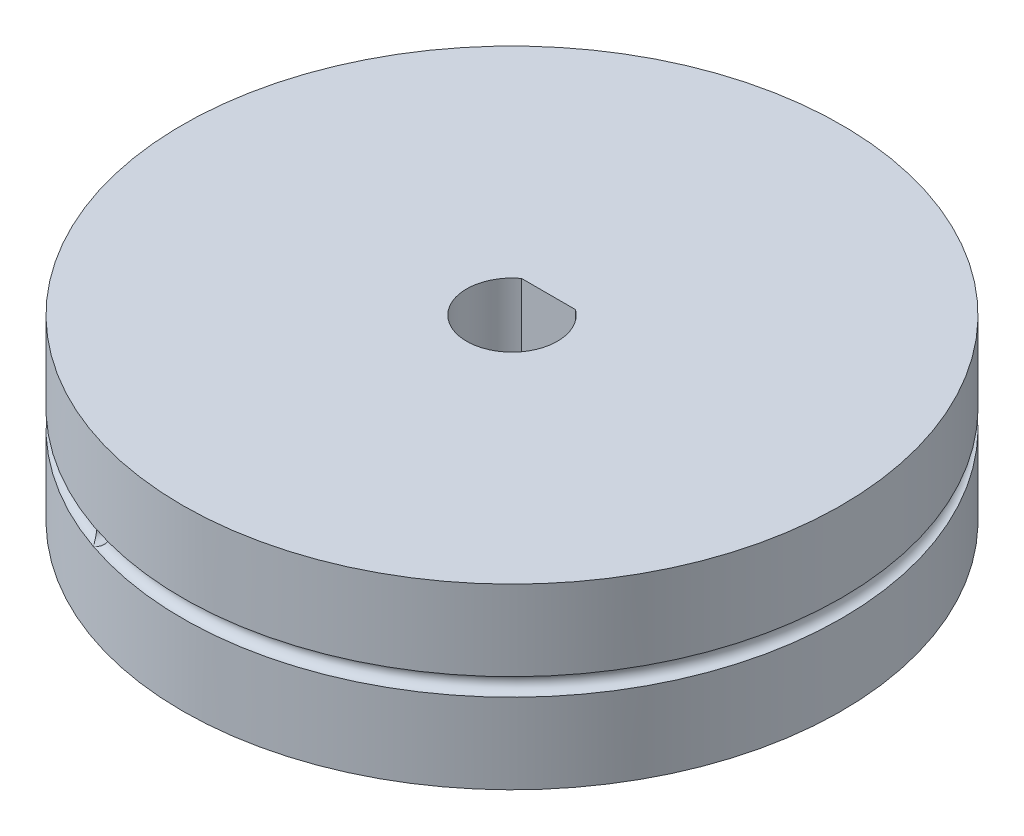
ISO-10303-21;
HEADER;
FILE_DESCRIPTION(('STEP AP214'),'2;1');
FILE_NAME('part.step','',(''),(''),'','','');
FILE_SCHEMA(('AUTOMOTIVE_DESIGN { 1 0 10303 214 1 1 1 1 }'));
ENDSEC;
DATA;
#1=APPLICATION_CONTEXT('core data for automotive mechanical design processes');
#2=APPLICATION_PROTOCOL_DEFINITION('international standard','automotive_design',2000,#1);
#3=PRODUCT_CONTEXT('',#1,'mechanical');
#4=PRODUCT('Part','Part','',(#3));
#5=PRODUCT_RELATED_PRODUCT_CATEGORY('part','',(#4));
#6=PRODUCT_DEFINITION_FORMATION('','',#4);
#7=PRODUCT_DEFINITION_CONTEXT('part definition',#1,'design');
#8=PRODUCT_DEFINITION('design','',#6,#7);
#9=PRODUCT_DEFINITION_SHAPE('','',#8);
#10=(LENGTH_UNIT() NAMED_UNIT(*) SI_UNIT(.MILLI.,.METRE.));
#11=(NAMED_UNIT(*) PLANE_ANGLE_UNIT() SI_UNIT($,.RADIAN.));
#12=(NAMED_UNIT(*) SI_UNIT($,.STERADIAN.) SOLID_ANGLE_UNIT());
#13=UNCERTAINTY_MEASURE_WITH_UNIT(LENGTH_MEASURE(1.E-05),#10,'distance_accuracy_value','');
#14=(GEOMETRIC_REPRESENTATION_CONTEXT(3) GLOBAL_UNCERTAINTY_ASSIGNED_CONTEXT((#13)) GLOBAL_UNIT_ASSIGNED_CONTEXT((#10,
#11,#12)) REPRESENTATION_CONTEXT('',''));
#15=CARTESIAN_POINT('',(0.,0.,0.));
#16=DIRECTION('',(0.,0.,1.));
#17=DIRECTION('',(1.,0.,0.));
#18=AXIS2_PLACEMENT_3D('',#15,#16,#17);
#19=CARTESIAN_POINT('',(0.,5.,0.));
#20=DIRECTION('',(0.,1.,0.));
#21=DIRECTION('',(0.,0.,1.));
#22=AXIS2_PLACEMENT_3D('',#19,#20,#21);
#23=TOROIDAL_SURFACE('',#22,18.5,0.499999999999999);
#24=CARTESIAN_POINT('',(-6.,4.5,17.5));
#25=CARTESIAN_POINT('',(-6.00089082453227,4.50000002366187,17.4987528477029));
#26=CARTESIAN_POINT('',(-6.00178163425127,4.50000240356781,17.4975055807074));
#27=CARTESIAN_POINT('',(-6.0501565773212,4.50025972197273,17.4297660691981));
#28=CARTESIAN_POINT('',(-6.09758176117397,4.50721376263087,17.3629720413323));
#29=CARTESIAN_POINT('',(-6.16730734949084,4.52819986412539,17.264212661646));
#30=CARTESIAN_POINT('',(-6.19032623206661,4.53696220439458,17.2315137266585));
#31=CARTESIAN_POINT('',(-6.23567722129492,4.55831625991109,17.1669115512512));
#32=CARTESIAN_POINT('',(-6.25801012958801,4.57090330227527,17.1350073909837));
#33=CARTESIAN_POINT('',(-6.29794876104842,4.59787491991483,17.0777980487317));
#34=CARTESIAN_POINT('',(-6.315713995237,4.61159293541338,17.0522911276434));
#35=CARTESIAN_POINT('',(-6.35025524078634,4.64242785628903,17.0025912660083));
#36=CARTESIAN_POINT('',(-6.36702990057882,4.6595492724462,16.9784001241435));
#37=CARTESIAN_POINT('',(-6.3992814234726,4.69798114794401,16.9317973145947));
#38=CARTESIAN_POINT('',(-6.41473604393395,4.71934853678563,16.9094163932503));
#39=CARTESIAN_POINT('',(-6.44309439299227,4.76671856191877,16.8682776851541));
#40=CARTESIAN_POINT('',(-6.45601314312225,4.79269205316861,16.8494985787977));
#41=CARTESIAN_POINT('',(-6.4712896959111,4.83255759990131,16.8272650069137));
#42=CARTESIAN_POINT('',(-6.47535555088504,4.84443443447294,16.8213437919529));
#43=CARTESIAN_POINT('',(-6.48268938914577,4.8689475392764,16.8106587633007));
#44=CARTESIAN_POINT('',(-6.48595698313059,4.88158417632596,16.8058955143403));
#45=CARTESIAN_POINT('',(-6.49223564589433,4.91069134765433,16.7967401495371));
#46=CARTESIAN_POINT('',(-6.49498706774411,4.92734183257898,16.7927258377733));
#47=CARTESIAN_POINT('',(-6.49878683354962,4.96124257750273,16.787181215093));
#48=CARTESIAN_POINT('',(-6.49983601753373,4.97849253737456,16.7856496789651));
#49=CARTESIAN_POINT('',(-6.50012840396766,5.0130720593386,16.7852229145944));
#50=CARTESIAN_POINT('',(-6.49936852361962,5.03040170701285,16.7863321865109));
#51=CARTESIAN_POINT('',(-6.49611414814097,5.06454170462213,16.7910813257638));
#52=CARTESIAN_POINT('',(-6.49361842854827,5.08135167923163,16.7947229794436));
#53=CARTESIAN_POINT('',(-6.48656235733421,5.11677342647042,16.8050133807671));
#54=CARTESIAN_POINT('',(-6.4817247195097,5.13521072351581,16.8120657996442));
#55=CARTESIAN_POINT('',(-6.47041694934697,5.1704463507268,16.8285364014509));
#56=CARTESIAN_POINT('',(-6.46394422235347,5.18724201654516,16.8379583443735));
#57=CARTESIAN_POINT('',(-6.44639613722278,5.22670211310883,16.8634758540469));
#58=CARTESIAN_POINT('',(-6.43459534562485,5.24836203012125,16.88061496648));
#59=CARTESIAN_POINT('',(-6.40923687781034,5.28824507433734,16.9173796800758));
#60=CARTESIAN_POINT('',(-6.39567522526671,5.30646018666664,16.9370109065534));
#61=CARTESIAN_POINT('',(-6.35788457277012,5.35108594483659,16.9916100355349));
#62=CARTESIAN_POINT('',(-6.33259961001591,5.3748036340589,17.0280361805101));
#63=CARTESIAN_POINT('',(-6.28020123026314,5.4154337459751,17.1032620329268));
#64=CARTESIAN_POINT('',(-6.25308325800474,5.4323284280945,17.1420676296146));
#65=CARTESIAN_POINT('',(-6.18949086009377,5.46445182288929,17.2327468661475));
#66=CARTESIAN_POINT('',(-6.15264081677689,5.47767615075106,17.2850621562151));
#67=CARTESIAN_POINT('',(-6.07811005647727,5.495336726099,17.3903818131184));
#68=CARTESIAN_POINT('',(-6.04043127444163,5.49979161829345,17.4433844763236));
#69=CARTESIAN_POINT('',(-6.00178165840606,5.49999760552885,17.4975055457104));
#70=CARTESIAN_POINT('',(-6.0008908490347,5.49999998566952,17.4987528121976));
#71=CARTESIAN_POINT('',(-6.,5.5,17.5));
#72=B_SPLINE_CURVE_WITH_KNOTS('',3,(#24,#25,#26,#27,#28,#29,#30,#31,#32,#33,#34,#35,#36,#37,#38,
#39,#40,#41,#42,#43,#44,#45,#46,#47,#48,#49,#50,#51,#52,#53,#54,#55,#56,#57,#58,#59,#60,#61,#62,
#63,#64,#65,#66,#67,#68,#69,#70,#71),.UNSPECIFIED.,.F.,.F.,(4,2,2,2,2,2,2,2,2,2,2,2,2,2,2,2,2,2,
2,2,2,2,2,4),(0.,0.00459814182074894,0.249705437929898,0.3723953658226,0.49493599421972,
0.596700953711476,0.698601700133934,0.801974162682908,0.904714470788939,0.946278430140854,
0.987862619434869,1.03964972093591,1.09141125851172,1.14326106522233,1.19514748396182,
1.25578757384,1.31652450217346,1.40612745068738,1.49593637644598,1.64595714716207,
1.79636551527864,1.9916930297503,2.18660480767776,2.1912029494985),.UNSPECIFIED.);
#73=CARTESIAN_POINT('',(-6.,4.5,17.5));
#74=VERTEX_POINT('',#73);
#75=CARTESIAN_POINT('',(-6.,5.5,17.5));
#76=VERTEX_POINT('',#75);
#77=EDGE_CURVE('E62',#74,#76,#72,.T.);
#78=ORIENTED_EDGE('',*,*,#77,.T.);
#79=CARTESIAN_POINT('',(0.,5.5,0.));
#80=DIRECTION('',(0.,-1.,0.));
#81=DIRECTION('',(0.,0.,-1.));
#82=AXIS2_PLACEMENT_3D('',#79,#80,#81);
#83=CIRCLE('',#82,18.5);
#84=CARTESIAN_POINT('',(-6.,5.5,-17.5));
#85=VERTEX_POINT('',#84);
#86=EDGE_CURVE('E43',#85,#76,#83,.F.);
#87=ORIENTED_EDGE('',*,*,#86,.F.);
#88=CARTESIAN_POINT('',(-6.,5.5,-17.5));
#89=CARTESIAN_POINT('',(-6.00089082455213,5.49999997633397,-17.4987528476737));
#90=CARTESIAN_POINT('',(-6.0017816342706,5.49999759642809,-17.4975055806786));
#91=CARTESIAN_POINT('',(-6.05015544973691,5.49974028423594,-17.4297676481871));
#92=CARTESIAN_POINT('',(-6.09757945383221,5.49278657912727,-17.3629752933665));
#93=CARTESIAN_POINT('',(-6.16730451052101,5.47180116624821,-17.264216690901));
#94=CARTESIAN_POINT('',(-6.1903238930566,5.46303879002751,-17.2315170513602));
#95=CARTESIAN_POINT('',(-6.23567584726904,5.4416844940225,-17.1669135157041));
#96=CARTESIAN_POINT('',(-6.25800921400838,5.42909720692975,-17.1350087071991));
#97=CARTESIAN_POINT('',(-6.2982776968772,5.40190303324392,-17.0773268668012));
#98=CARTESIAN_POINT('',(-6.31635923760526,5.38790864135831,-17.0513646722674));
#99=CARTESIAN_POINT('',(-6.35148895320386,5.35638887731775,-17.0008140726695));
#100=CARTESIAN_POINT('',(-6.36853575086355,5.33885892793843,-16.97622750178));
#101=CARTESIAN_POINT('',(-6.40126947340671,5.29942012872321,-16.92892089962));
#102=CARTESIAN_POINT('',(-6.4169316962742,5.27744857846575,-16.9062350503115));
#103=CARTESIAN_POINT('',(-6.44554895738091,5.22864153496645,-16.8647124636616));
#104=CARTESIAN_POINT('',(-6.45851861047782,5.20183385944444,-16.8458549596967));
#105=CARTESIAN_POINT('',(-6.47480999309058,5.15751400298365,-16.8221394975521));
#106=CARTESIAN_POINT('',(-6.47975094364808,5.14185150369109,-16.8149410316029));
#107=CARTESIAN_POINT('',(-6.48818512514438,5.10934516843046,-16.8026475978512));
#108=CARTESIAN_POINT('',(-6.49167964881386,5.092502403128,-16.7975507517608));
#109=CARTESIAN_POINT('',(-6.49695604726528,5.05782880355579,-16.789853163933));
#110=CARTESIAN_POINT('',(-6.49872337882397,5.03999089364568,-16.7872736185133));
#111=CARTESIAN_POINT('',(-6.50030654084355,5.00404568469862,-16.7849629452451));
#112=CARTESIAN_POINT('',(-6.50012330428603,4.98593851858876,-16.7852304556135));
#113=CARTESIAN_POINT('',(-6.49794914866464,4.95197583049766,-16.7884035412623));
#114=CARTESIAN_POINT('',(-6.49614678992303,4.93608082958431,-16.7910339375068));
#115=CARTESIAN_POINT('',(-6.49114465911752,4.90499908012884,-16.7983310162129));
#116=CARTESIAN_POINT('',(-6.48794415241748,4.88981270857478,-16.8029987691722));
#117=CARTESIAN_POINT('',(-6.47896159773439,4.85499244454548,-16.816091644344));
#118=CARTESIAN_POINT('',(-6.47266306468696,4.83577560344016,-16.8252672148793));
#119=CARTESIAN_POINT('',(-6.45840136841942,4.79936959085612,-16.8460215272866));
#120=CARTESIAN_POINT('',(-6.45043458315658,4.7821849607977,-16.8576054977839));
#121=CARTESIAN_POINT('',(-6.42866804575398,4.74107922808024,-16.8892163451968));
#122=CARTESIAN_POINT('',(-6.414038518223,4.71851827324338,-16.9104290385831));
#123=CARTESIAN_POINT('',(-6.38298565080738,4.67753431551371,-16.9553594723429));
#124=CARTESIAN_POINT('',(-6.36655795210863,4.6591217138387,-16.9790832949573));
#125=CARTESIAN_POINT('',(-6.32086130362482,4.61443068895067,-17.0449256448849));
#126=CARTESIAN_POINT('',(-6.29051243576212,4.59141828608175,-17.0885009814506));
#127=CARTESIAN_POINT('',(-6.22806570308272,4.55355147940975,-17.1777994089158));
#128=CARTESIAN_POINT('',(-6.19596534315206,4.53870906640157,-17.2235255502814));
#129=CARTESIAN_POINT('',(-6.13702927256662,4.51833850557306,-17.3071362565104));
#130=CARTESIAN_POINT('',(-6.11036151140229,4.51157153000903,-17.3448470646652));
#131=CARTESIAN_POINT('',(-6.05670132912268,4.50248221869649,-17.4204782126569));
#132=CARTESIAN_POINT('',(-6.02970962439644,4.50015142871467,-17.4583980155428));
#133=CARTESIAN_POINT('',(-6.0017816631718,4.50000238826375,-17.4975055387325));
#134=CARTESIAN_POINT('',(-6.00089085374311,4.50000000790593,-17.4987528052927));
#135=CARTESIAN_POINT('',(-6.,4.5,-17.5));
#136=B_SPLINE_CURVE_WITH_KNOTS('',3,(#88,#89,#90,#91,#92,#93,#94,#95,#96,#97,#98,#99,#100,#101,
#102,#103,#104,#105,#106,#107,#108,#109,#110,#111,#112,#113,#114,#115,#116,#117,#118,#119,#120,
#121,#122,#123,#124,#125,#126,#127,#128,#129,#130,#131,#132,#133,#134,#135),.UNSPECIFIED.,.F.,
.F.,(4,2,2,2,2,2,2,2,2,2,2,2,2,2,2,2,2,2,2,2,2,2,2,4),(0.,0.00459814182073694,0.249699622952677,
0.372391823392671,0.494936008681134,0.598547015829722,0.702293031586386,0.807621147054346,
0.912361680009282,0.965977683648832,1.01954566446822,1.07356090641279,1.12755031334023,
1.17596637597353,1.22440790876579,1.29065531810631,1.35704808085879,1.45921871658818,
1.56164274362171,1.73431244169161,1.90723488961331,2.04706884516284,2.18663604513594,
2.1912341869567),.UNSPECIFIED.);
#137=CARTESIAN_POINT('',(-6.,4.5,-17.5));
#138=VERTEX_POINT('',#137);
#139=EDGE_CURVE('E79',#138,#85,#136,.F.);
#140=ORIENTED_EDGE('',*,*,#139,.F.);
#141=CARTESIAN_POINT('',(0.,4.5,0.));
#142=DIRECTION('',(0.,1.,0.));
#143=DIRECTION('',(0.,0.,1.));
#144=AXIS2_PLACEMENT_3D('',#141,#142,#143);
#145=CIRCLE('',#144,18.5);
#146=EDGE_CURVE('E100',#74,#138,#145,.F.);
#147=ORIENTED_EDGE('',*,*,#146,.F.);
#148=EDGE_LOOP('',(#78,#87,#140,#147));
#149=FACE_BOUND('',#148,.T.);
#150=ADVANCED_FACE('F39',(#149),#23,.F.);
#151=CARTESIAN_POINT('',(-6.,5.5,17.5));
#152=CARTESIAN_POINT('',(-5.99875286013006,5.50000000246173,17.4991091866197));
#153=CARTESIAN_POINT('',(-5.99750566419402,5.49999533625984,17.4982182643048));
#154=CARTESIAN_POINT('',(-5.96176696349385,5.4997278248078,17.4726866998688));
#155=CARTESIAN_POINT('',(-5.92725322516525,5.49589850628534,17.4479776559006));
#156=CARTESIAN_POINT('',(-5.85923334397666,5.48104162991155,17.399179020931));
#157=CARTESIAN_POINT('',(-5.8257300465583,5.46999542860868,17.3750912027397));
#158=CARTESIAN_POINT('',(-5.76662427936852,5.4431661074981,17.3325121796306));
#159=CARTESIAN_POINT('',(-5.74066599565571,5.42855201771749,17.3137798438771));
#160=CARTESIAN_POINT('',(-5.69107935446952,5.39430074014829,17.2779426849561));
#161=CARTESIAN_POINT('',(-5.66744646376597,5.37467360499844,17.2608346975872));
#162=CARTESIAN_POINT('',(-5.62754193099748,5.33454561272405,17.2319098731094));
#163=CARTESIAN_POINT('',(-5.61071750726956,5.31487938694414,17.2196998545424));
#164=CARTESIAN_POINT('',(-5.57989272295977,5.27239244183149,17.1973091891235));
#165=CARTESIAN_POINT('',(-5.56589199985526,5.24957212807319,17.1871282817649));
#166=CARTESIAN_POINT('',(-5.54134355786307,5.20095167064473,17.1692652702425));
#167=CARTESIAN_POINT('',(-5.53082596486103,5.1751280131865,17.1616049704929));
#168=CARTESIAN_POINT('',(-5.51415230183724,5.12140781203751,17.1494561227));
#169=CARTESIAN_POINT('',(-5.50799102645169,5.09351378643957,17.1449637892707));
#170=CARTESIAN_POINT('',(-5.50107530121365,5.04090149008203,17.1399208776117));
#171=CARTESIAN_POINT('',(-5.49966294641665,5.01631393082996,17.1388906767636));
#172=CARTESIAN_POINT('',(-5.50047237838281,4.96723517445916,17.1394810208957));
#173=CARTESIAN_POINT('',(-5.50269277807456,4.9427439441386,17.1411005541448));
#174=CARTESIAN_POINT('',(-5.51033577019213,4.89635187295668,17.1466731780932));
#175=CARTESIAN_POINT('',(-5.51552174869889,4.87439009388484,17.1504538322199));
#176=CARTESIAN_POINT('',(-5.5286268234582,4.83175952247426,17.1600027168865));
#177=CARTESIAN_POINT('',(-5.53654630852725,4.81109091457172,17.1657712301812));
#178=CARTESIAN_POINT('',(-5.55534660874129,4.77016872601337,17.1794561822445));
#179=CARTESIAN_POINT('',(-5.56638413107472,4.75002577025698,17.1874861855941));
#180=CARTESIAN_POINT('',(-5.59069984687954,4.71192908256376,17.2051612684435));
#181=CARTESIAN_POINT('',(-5.60397902139168,4.69397631509669,17.2148070550634));
#182=CARTESIAN_POINT('',(-5.63454336934135,4.65782364921528,17.2369871207876));
#183=CARTESIAN_POINT('',(-5.65213052163766,4.64001244312768,17.2497374526048));
#184=CARTESIAN_POINT('',(-5.68915635928956,4.60759335945884,17.2765473757278));
#185=CARTESIAN_POINT('',(-5.70859640547321,4.59298786266789,17.2906079291327));
#186=CARTESIAN_POINT('',(-5.75273180529088,4.56448396838277,17.3224881183305));
#187=CARTESIAN_POINT('',(-5.77771873035251,4.55126205989683,17.3405105687051));
#188=CARTESIAN_POINT('',(-5.82896166483527,4.52933612980629,17.3774101605116));
#189=CARTESIAN_POINT('',(-5.85521777390313,4.52063246357168,17.3962873690453));
#190=CARTESIAN_POINT('',(-5.91949099033167,4.50501187665394,17.4424195093236));
#191=CARTESIAN_POINT('',(-5.95790468762886,4.50030133516918,17.4699274947938));
#192=CARTESIAN_POINT('',(-5.99750569931301,4.5000046553455,17.4982182898113));
#193=CARTESIAN_POINT('',(-5.99875289608272,4.4999999889517,17.4991092127347));
#194=CARTESIAN_POINT('',(-6.,4.5,17.5));
#195=B_SPLINE_CURVE_WITH_KNOTS('',3,(#151,#152,#153,#154,#155,#156,#157,#158,#159,#160,#161,
#162,#163,#164,#165,#166,#167,#168,#169,#170,#171,#172,#173,#174,#175,#176,#177,#178,#179,#180,
#181,#182,#183,#184,#185,#186,#187,#188,#189,#190,#191,#192,#193,#194),.UNSPECIFIED.,.F.,.F.,(4,
2,2,2,2,2,2,2,2,2,2,2,2,2,2,2,2,2,2,2,2,4),(0.,0.00459815758273977,0.131758240530638,
0.259248123335437,0.364400914960967,0.469344477355052,0.554857310297851,0.640359157621418,
0.726582297723804,0.812702234881679,0.886252428653456,0.959774545778578,1.02811704758025,
1.09646927449128,1.16918272801467,1.24192808688053,1.32588975513571,1.40991356994139,
1.51010064933817,1.61029560748216,1.75169080178366,1.7562889593664),.UNSPECIFIED.);
#196=EDGE_CURVE('E95',#76,#74,#195,.T.);
#197=ORIENTED_EDGE('',*,*,#196,.T.);
#198=EDGE_CURVE('E93',#138,#74,#145,.F.);
#199=ORIENTED_EDGE('',*,*,#198,.F.);
#200=CARTESIAN_POINT('',(-6.,5.5,-17.5));
#201=CARTESIAN_POINT('',(-5.99875286013006,5.50000000246173,-17.4991091866197));
#202=CARTESIAN_POINT('',(-5.99750566419402,5.49999533625984,-17.4982182643048));
#203=CARTESIAN_POINT('',(-5.96176696349385,5.4997278248078,-17.4726866998688));
#204=CARTESIAN_POINT('',(-5.92725322516525,5.49589850628534,-17.4479776559006));
#205=CARTESIAN_POINT('',(-5.85923334397666,5.48104162991155,-17.399179020931));
#206=CARTESIAN_POINT('',(-5.8257300465583,5.46999542860867,-17.3750912027397));
#207=CARTESIAN_POINT('',(-5.76662427936852,5.4431661074981,-17.3325121796306));
#208=CARTESIAN_POINT('',(-5.74066599565571,5.42855201771749,-17.3137798438771));
#209=CARTESIAN_POINT('',(-5.69107935446952,5.39430074014829,-17.2779426849561));
#210=CARTESIAN_POINT('',(-5.66744646376597,5.37467360499844,-17.2608346975872));
#211=CARTESIAN_POINT('',(-5.62754193099748,5.33454561272405,-17.2319098731095));
#212=CARTESIAN_POINT('',(-5.61071750726956,5.31487938694414,-17.2196998545424));
#213=CARTESIAN_POINT('',(-5.57989272295977,5.27239244183149,-17.1973091891235));
#214=CARTESIAN_POINT('',(-5.56589199985526,5.24957212807319,-17.1871282817649));
#215=CARTESIAN_POINT('',(-5.54134355786307,5.20095167064473,-17.1692652702425));
#216=CARTESIAN_POINT('',(-5.53082596486103,5.1751280131865,-17.1616049704929));
#217=CARTESIAN_POINT('',(-5.51415230183724,5.12140781203751,-17.1494561227));
#218=CARTESIAN_POINT('',(-5.50799102645169,5.09351378643957,-17.1449637892707));
#219=CARTESIAN_POINT('',(-5.50107530121365,5.04090149008203,-17.1399208776117));
#220=CARTESIAN_POINT('',(-5.49966294641665,5.01631393082996,-17.1388906767636));
#221=CARTESIAN_POINT('',(-5.50047237838281,4.96723517445916,-17.1394810208957));
#222=CARTESIAN_POINT('',(-5.50269277807456,4.9427439441386,-17.1411005541448));
#223=CARTESIAN_POINT('',(-5.51033577019213,4.89635187295668,-17.1466731780932));
#224=CARTESIAN_POINT('',(-5.51552174869889,4.87439009388484,-17.1504538322199));
#225=CARTESIAN_POINT('',(-5.5286268234582,4.83175952247426,-17.1600027168865));
#226=CARTESIAN_POINT('',(-5.53654630852725,4.81109091457172,-17.1657712301812));
#227=CARTESIAN_POINT('',(-5.55534660874129,4.77016872601337,-17.1794561822445));
#228=CARTESIAN_POINT('',(-5.56638413107472,4.75002577025698,-17.1874861855941));
#229=CARTESIAN_POINT('',(-5.59069984687954,4.71192908256376,-17.2051612684435));
#230=CARTESIAN_POINT('',(-5.60397902139168,4.69397631509669,-17.2148070550634));
#231=CARTESIAN_POINT('',(-5.63454336934135,4.65782364921528,-17.2369871207876));
#232=CARTESIAN_POINT('',(-5.65213052163766,4.64001244312768,-17.2497374526048));
#233=CARTESIAN_POINT('',(-5.68915635928956,4.60759335945884,-17.2765473757278));
#234=CARTESIAN_POINT('',(-5.7085964054732,4.59298786266789,-17.2906079291327));
#235=CARTESIAN_POINT('',(-5.75273180529088,4.56448396838277,-17.3224881183305));
#236=CARTESIAN_POINT('',(-5.77771873035251,4.55126205989683,-17.3405105687051));
#237=CARTESIAN_POINT('',(-5.82896166483528,4.52933612980629,-17.3774101605116));
#238=CARTESIAN_POINT('',(-5.85521777390313,4.52063246357168,-17.3962873690453));
#239=CARTESIAN_POINT('',(-5.91949099033167,4.50501187665394,-17.4424195093237));
#240=CARTESIAN_POINT('',(-5.95790468762885,4.50030133516917,-17.4699274947938));
#241=CARTESIAN_POINT('',(-5.99750569931301,4.5000046553455,-17.4982182898113));
#242=CARTESIAN_POINT('',(-5.99875289608272,4.4999999889517,-17.4991092127347));
#243=CARTESIAN_POINT('',(-6.,4.5,-17.5));
#244=B_SPLINE_CURVE_WITH_KNOTS('',3,(#200,#201,#202,#203,#204,#205,#206,#207,#208,#209,#210,
#211,#212,#213,#214,#215,#216,#217,#218,#219,#220,#221,#222,#223,#224,#225,#226,#227,#228,#229,
#230,#231,#232,#233,#234,#235,#236,#237,#238,#239,#240,#241,#242,#243),.UNSPECIFIED.,.F.,.F.,(4,
2,2,2,2,2,2,2,2,2,2,2,2,2,2,2,2,2,2,2,2,4),(0.,0.00459815758274048,0.13175824053064,
0.259248123335438,0.364400914960966,0.469344477355048,0.554857310297848,0.640359157621417,
0.726582297723802,0.812702234881678,0.886252428653455,0.959774545778578,1.02811704758025,
1.09646927449128,1.16918272801467,1.24192808688053,1.32588975513571,1.40991356994139,
1.51010064933817,1.61029560748215,1.75169080178366,1.7562889593664),.UNSPECIFIED.);
#245=EDGE_CURVE('E55',#85,#138,#244,.T.);
#246=ORIENTED_EDGE('',*,*,#245,.F.);
#247=EDGE_CURVE('E90',#76,#85,#83,.F.);
#248=ORIENTED_EDGE('',*,*,#247,.F.);
#249=EDGE_LOOP('',(#197,#199,#246,#248));
#250=FACE_BOUND('',#249,.T.);
#251=ADVANCED_FACE('F89',(#250),#23,.F.);
#252=CARTESIAN_POINT('',(0.,10.,0.));
#253=DIRECTION('',(0.,1.,0.));
#254=DIRECTION('',(0.,0.,1.));
#255=AXIS2_PLACEMENT_3D('',#252,#253,#254);
#256=PLANE('',#255);
#257=CARTESIAN_POINT('',(0.,10.,0.));
#258=DIRECTION('',(0.,1.,0.));
#259=DIRECTION('',(0.,0.,1.));
#260=AXIS2_PLACEMENT_3D('',#257,#258,#259);
#261=CIRCLE('',#260,18.5);
#262=CARTESIAN_POINT('',(0.,10.,18.5));
#263=VERTEX_POINT('',#262);
#264=EDGE_CURVE('E11',#263,#263,#261,.T.);
#265=ORIENTED_EDGE('',*,*,#264,.T.);
#266=EDGE_LOOP('',(#265));
#267=FACE_BOUND('',#266,.T.);
#268=CARTESIAN_POINT('',(0.,10.,0.));
#269=DIRECTION('',(0.,1.,0.));
#270=DIRECTION('',(0.,0.,1.));
#271=AXIS2_PLACEMENT_3D('',#268,#269,#270);
#272=CIRCLE('',#271,2.55);
#273=CARTESIAN_POINT('',(-1.51657508881031,10.,-2.05));
#274=VERTEX_POINT('',#273);
#275=CARTESIAN_POINT('',(1.51657508881031,10.,-2.05));
#276=VERTEX_POINT('',#275);
#277=EDGE_CURVE('E118',#274,#276,#272,.T.);
#278=ORIENTED_EDGE('',*,*,#277,.F.);
#279=DIRECTION('',(1.,0.,0.));
#280=VECTOR('',#279,1.);
#281=CARTESIAN_POINT('',(0.,10.,-2.05));
#282=LINE('',#281,#280);
#283=EDGE_CURVE('E122',#274,#276,#282,.T.);
#284=ORIENTED_EDGE('',*,*,#283,.T.);
#285=EDGE_LOOP('',(#278,#284));
#286=FACE_BOUND('',#285,.T.);
#287=ADVANCED_FACE('F167',(#267,#286),#256,.T.);
#288=CARTESIAN_POINT('',(0.,0.,0.));
#289=DIRECTION('',(0.,1.,0.));
#290=DIRECTION('',(0.,0.,1.));
#291=AXIS2_PLACEMENT_3D('',#288,#289,#290);
#292=PLANE('',#291);
#293=CARTESIAN_POINT('',(0.,0.,0.));
#294=DIRECTION('',(0.,1.,0.));
#295=DIRECTION('',(0.,0.,1.));
#296=AXIS2_PLACEMENT_3D('',#293,#294,#295);
#297=CIRCLE('',#296,18.5);
#298=CARTESIAN_POINT('',(0.,0.,18.5));
#299=VERTEX_POINT('',#298);
#300=EDGE_CURVE('E48',#299,#299,#297,.T.);
#301=ORIENTED_EDGE('',*,*,#300,.F.);
#302=EDGE_LOOP('',(#301));
#303=FACE_BOUND('',#302,.T.);
#304=DIRECTION('',(-1.,0.,0.));
#305=VECTOR('',#304,1.);
#306=CARTESIAN_POINT('',(0.,0.,-2.05));
#307=LINE('',#306,#305);
#308=CARTESIAN_POINT('',(1.51657508881031,0.,-2.05));
#309=VERTEX_POINT('',#308);
#310=CARTESIAN_POINT('',(-1.51657508881031,0.,-2.05));
#311=VERTEX_POINT('',#310);
#312=EDGE_CURVE('E125',#309,#311,#307,.T.);
#313=ORIENTED_EDGE('',*,*,#312,.T.);
#314=CARTESIAN_POINT('',(0.,0.,0.));
#315=DIRECTION('',(0.,1.,0.));
#316=DIRECTION('',(0.,0.,1.));
#317=AXIS2_PLACEMENT_3D('',#314,#315,#316);
#318=CIRCLE('',#317,2.55);
#319=EDGE_CURVE('E107',#309,#311,#318,.F.);
#320=ORIENTED_EDGE('',*,*,#319,.F.);
#321=EDGE_LOOP('',(#313,#320));
#322=FACE_BOUND('',#321,.T.);
#323=ADVANCED_FACE('F169',(#303,#322),#292,.F.);
#324=CARTESIAN_POINT('',(0.,10.,0.));
#325=DIRECTION('',(0.,-1.,0.));
#326=DIRECTION('',(0.,0.,-1.));
#327=AXIS2_PLACEMENT_3D('',#324,#325,#326);
#328=CYLINDRICAL_SURFACE('',#327,18.5);
#329=ORIENTED_EDGE('',*,*,#86,.T.);
#330=ORIENTED_EDGE('',*,*,#247,.T.);
#331=EDGE_LOOP('',(#329,#330));
#332=FACE_BOUND('',#331,.T.);
#333=ORIENTED_EDGE('',*,*,#264,.F.);
#334=EDGE_LOOP('',(#333));
#335=FACE_BOUND('',#334,.T.);
#336=ADVANCED_FACE('F98',(#332,#335),#328,.T.);
#337=ORIENTED_EDGE('',*,*,#146,.T.);
#338=ORIENTED_EDGE('',*,*,#198,.T.);
#339=EDGE_LOOP('',(#337,#338));
#340=FACE_BOUND('',#339,.T.);
#341=ORIENTED_EDGE('',*,*,#300,.T.);
#342=EDGE_LOOP('',(#341));
#343=FACE_BOUND('',#342,.T.);
#344=ADVANCED_FACE('F41',(#340,#343),#328,.T.);
#345=CARTESIAN_POINT('',(0.,-0.000999999999999265,-2.05));
#346=DIRECTION('',(0.,0.,1.));
#347=DIRECTION('',(1.,0.,0.));
#348=AXIS2_PLACEMENT_3D('',#345,#346,#347);
#349=PLANE('',#348);
#350=DIRECTION('',(0.,1.,0.));
#351=VECTOR('',#350,1.);
#352=CARTESIAN_POINT('',(1.51657508881031,-0.000999999999999265,-2.05));
#353=LINE('',#352,#351);
#354=EDGE_CURVE('E109',#309,#276,#353,.T.);
#355=ORIENTED_EDGE('',*,*,#354,.T.);
#356=ORIENTED_EDGE('',*,*,#283,.F.);
#357=DIRECTION('',(0.,1.,0.));
#358=VECTOR('',#357,1.);
#359=CARTESIAN_POINT('',(-1.51657508881031,-0.000999999999999265,-2.05));
#360=LINE('',#359,#358);
#361=EDGE_CURVE('E115',#311,#274,#360,.T.);
#362=ORIENTED_EDGE('',*,*,#361,.F.);
#363=ORIENTED_EDGE('',*,*,#312,.F.);
#364=EDGE_LOOP('',(#355,#356,#362,#363));
#365=FACE_BOUND('',#364,.T.);
#366=ADVANCED_FACE('F161',(#365),#349,.T.);
#367=CARTESIAN_POINT('',(0.,-0.000999999999999265,0.));
#368=DIRECTION('',(0.,1.,0.));
#369=DIRECTION('',(0.,0.,1.));
#370=AXIS2_PLACEMENT_3D('',#367,#368,#369);
#371=CYLINDRICAL_SURFACE('',#370,2.55);
#372=ORIENTED_EDGE('',*,*,#319,.T.);
#373=ORIENTED_EDGE('',*,*,#361,.T.);
#374=ORIENTED_EDGE('',*,*,#277,.T.);
#375=ORIENTED_EDGE('',*,*,#354,.F.);
#376=EDGE_LOOP('',(#372,#373,#374,#375));
#377=FACE_BOUND('',#376,.T.);
#378=ADVANCED_FACE('F157',(#377),#371,.F.);
#379=CARTESIAN_POINT('',(-6.,5.,18.501));
#380=DIRECTION('',(0.,0.,-1.));
#381=DIRECTION('',(-1.,0.,0.));
#382=AXIS2_PLACEMENT_3D('',#379,#380,#381);
#383=CYLINDRICAL_SURFACE('',#382,0.500000000000001);
#384=ORIENTED_EDGE('',*,*,#196,.F.);
#385=ORIENTED_EDGE('',*,*,#77,.F.);
#386=EDGE_LOOP('',(#384,#385));
#387=FACE_BOUND('',#386,.T.);
#388=ORIENTED_EDGE('',*,*,#245,.T.);
#389=ORIENTED_EDGE('',*,*,#139,.T.);
#390=EDGE_LOOP('',(#388,#389));
#391=FACE_BOUND('',#390,.T.);
#392=ADVANCED_FACE('F80',(#387,#391),#383,.F.);
#393=CLOSED_SHELL('',(#150,#251,#287,#323,#336,#344,#366,#378,#392));
#394=MANIFOLD_SOLID_BREP('B2',#393);
#395=ADVANCED_BREP_SHAPE_REPRESENTATION('',(#18,#394),#14);
#396=SHAPE_DEFINITION_REPRESENTATION(#9,#395);
ENDSEC;
END-ISO-10303-21;
